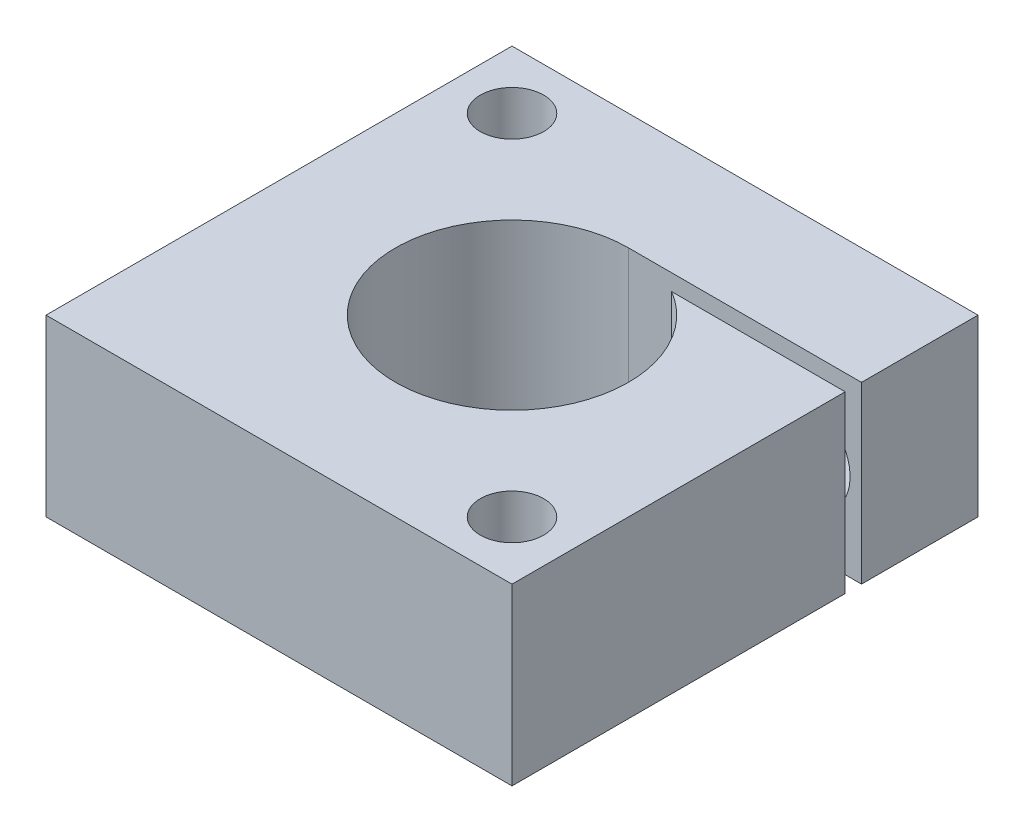
ISO-10303-21;
HEADER;
FILE_DESCRIPTION(('STEP AP214'),'2;1');
FILE_NAME('part.step','',(''),(''),'','','');
FILE_SCHEMA(('AUTOMOTIVE_DESIGN { 1 0 10303 214 1 1 1 1 }'));
ENDSEC;
DATA;
#1=APPLICATION_CONTEXT('core data for automotive mechanical design processes');
#2=APPLICATION_PROTOCOL_DEFINITION('international standard','automotive_design',2000,#1);
#3=PRODUCT_CONTEXT('',#1,'mechanical');
#4=PRODUCT('Part','Part','',(#3));
#5=PRODUCT_RELATED_PRODUCT_CATEGORY('part','',(#4));
#6=PRODUCT_DEFINITION_FORMATION('','',#4);
#7=PRODUCT_DEFINITION_CONTEXT('part definition',#1,'design');
#8=PRODUCT_DEFINITION('design','',#6,#7);
#9=PRODUCT_DEFINITION_SHAPE('','',#8);
#10=(LENGTH_UNIT() NAMED_UNIT(*) SI_UNIT(.MILLI.,.METRE.));
#11=(NAMED_UNIT(*) PLANE_ANGLE_UNIT() SI_UNIT($,.RADIAN.));
#12=(NAMED_UNIT(*) SI_UNIT($,.STERADIAN.) SOLID_ANGLE_UNIT());
#13=UNCERTAINTY_MEASURE_WITH_UNIT(LENGTH_MEASURE(1.E-05),#10,'distance_accuracy_value','');
#14=(GEOMETRIC_REPRESENTATION_CONTEXT(3) GLOBAL_UNCERTAINTY_ASSIGNED_CONTEXT((#13)) GLOBAL_UNIT_ASSIGNED_CONTEXT((#10,
#11,#12)) REPRESENTATION_CONTEXT('',''));
#15=CARTESIAN_POINT('',(0.,0.,0.));
#16=DIRECTION('',(0.,0.,1.));
#17=DIRECTION('',(1.,0.,0.));
#18=AXIS2_PLACEMENT_3D('',#15,#16,#17);
#19=CARTESIAN_POINT('',(-23.8993780326795,9.525,-15.7202520192622));
#20=DIRECTION('',(1.,0.,0.));
#21=DIRECTION('',(0.,0.,-1.));
#22=AXIS2_PLACEMENT_3D('',#19,#20,#21);
#23=PLANE('',#22);
#24=DIRECTION('',(0.,0.,1.));
#25=VECTOR('',#24,1.);
#26=CARTESIAN_POINT('',(-23.8993780326795,0.,-15.7202520192622));
#27=LINE('',#26,#25);
#28=CARTESIAN_POINT('',(-23.8993780326795,0.,-15.7202520192622));
#29=VERTEX_POINT('',#28);
#30=CARTESIAN_POINT('',(-23.8993780326795,0.,9.67974798073775));
#31=VERTEX_POINT('',#30);
#32=EDGE_CURVE('E135',#29,#31,#27,.T.);
#33=ORIENTED_EDGE('',*,*,#32,.T.);
#34=DIRECTION('',(0.,-1.,0.));
#35=VECTOR('',#34,1.);
#36=CARTESIAN_POINT('',(-23.8993780326795,9.525,9.67974798073775));
#37=LINE('',#36,#35);
#38=CARTESIAN_POINT('',(-23.8993780326795,9.525,9.67974798073775));
#39=VERTEX_POINT('',#38);
#40=EDGE_CURVE('E11',#39,#31,#37,.T.);
#41=ORIENTED_EDGE('',*,*,#40,.F.);
#42=DIRECTION('',(0.,0.,1.));
#43=VECTOR('',#42,1.);
#44=CARTESIAN_POINT('',(-23.8993780326795,9.525,-15.7202520192622));
#45=LINE('',#44,#43);
#46=CARTESIAN_POINT('',(-23.8993780326795,9.525,-15.7202520192622));
#47=VERTEX_POINT('',#46);
#48=EDGE_CURVE('E150',#47,#39,#45,.T.);
#49=ORIENTED_EDGE('',*,*,#48,.F.);
#50=DIRECTION('',(0.,-1.,0.));
#51=VECTOR('',#50,1.);
#52=CARTESIAN_POINT('',(-23.8993780326795,9.525,-15.7202520192622));
#53=LINE('',#52,#51);
#54=EDGE_CURVE('E131',#47,#29,#53,.T.);
#55=ORIENTED_EDGE('',*,*,#54,.T.);
#56=EDGE_LOOP('',(#33,#41,#49,#55));
#57=FACE_BOUND('',#56,.T.);
#58=ADVANCED_FACE('F37',(#57),#23,.F.);
#59=CARTESIAN_POINT('',(-23.8993780326795,9.525,9.67974798073775));
#60=DIRECTION('',(0.,0.,-1.));
#61=DIRECTION('',(-1.,0.,0.));
#62=AXIS2_PLACEMENT_3D('',#59,#60,#61);
#63=PLANE('',#62);
#64=DIRECTION('',(1.,0.,0.));
#65=VECTOR('',#64,1.);
#66=CARTESIAN_POINT('',(-23.8993780326795,0.,9.67974798073775));
#67=LINE('',#66,#65);
#68=CARTESIAN_POINT('',(1.50062196732047,0.,9.67974798073775));
#69=VERTEX_POINT('',#68);
#70=EDGE_CURVE('E138',#31,#69,#67,.T.);
#71=ORIENTED_EDGE('',*,*,#70,.T.);
#72=DIRECTION('',(0.,-1.,0.));
#73=VECTOR('',#72,1.);
#74=CARTESIAN_POINT('',(1.50062196732047,9.525,9.67974798073775));
#75=LINE('',#74,#73);
#76=CARTESIAN_POINT('',(1.50062196732047,9.525,9.67974798073775));
#77=VERTEX_POINT('',#76);
#78=EDGE_CURVE('E45',#77,#69,#75,.T.);
#79=ORIENTED_EDGE('',*,*,#78,.F.);
#80=DIRECTION('',(1.,0.,0.));
#81=VECTOR('',#80,1.);
#82=CARTESIAN_POINT('',(-23.8993780326795,9.525,9.67974798073775));
#83=LINE('',#82,#81);
#84=EDGE_CURVE('E97',#39,#77,#83,.T.);
#85=ORIENTED_EDGE('',*,*,#84,.F.);
#86=ORIENTED_EDGE('',*,*,#40,.T.);
#87=EDGE_LOOP('',(#71,#79,#85,#86));
#88=FACE_BOUND('',#87,.T.);
#89=ADVANCED_FACE('F221',(#88),#63,.F.);
#90=CARTESIAN_POINT('',(1.50062196732046,9.525,-8.48125201926225));
#91=DIRECTION('',(-1.,0.,0.));
#92=DIRECTION('',(0.,0.,1.));
#93=AXIS2_PLACEMENT_3D('',#90,#91,#92);
#94=PLANE('',#93);
#95=DIRECTION('',(0.,0.,-1.));
#96=VECTOR('',#95,1.);
#97=CARTESIAN_POINT('',(1.50062196732046,0.,-8.48125201926225));
#98=LINE('',#97,#96);
#99=CARTESIAN_POINT('',(1.50062196732046,0.,-8.48125201926225));
#100=VERTEX_POINT('',#99);
#101=EDGE_CURVE('E141',#69,#100,#98,.T.);
#102=ORIENTED_EDGE('',*,*,#101,.T.);
#103=DIRECTION('',(0.,-1.,0.));
#104=VECTOR('',#103,1.);
#105=CARTESIAN_POINT('',(1.50062196732046,9.525,-8.48125201926225));
#106=LINE('',#105,#104);
#107=CARTESIAN_POINT('',(1.50062196732046,9.525,-8.48125201926225));
#108=VERTEX_POINT('',#107);
#109=EDGE_CURVE('E157',#108,#100,#106,.T.);
#110=ORIENTED_EDGE('',*,*,#109,.F.);
#111=DIRECTION('',(0.,0.,-1.));
#112=VECTOR('',#111,1.);
#113=CARTESIAN_POINT('',(1.50062196732046,9.525,-8.48125201926225));
#114=LINE('',#113,#112);
#115=EDGE_CURVE('E165',#77,#108,#114,.T.);
#116=ORIENTED_EDGE('',*,*,#115,.F.);
#117=ORIENTED_EDGE('',*,*,#78,.T.);
#118=EDGE_LOOP('',(#102,#110,#116,#117));
#119=FACE_BOUND('',#118,.T.);
#120=ADVANCED_FACE('F163',(#119),#94,.F.);
#121=CARTESIAN_POINT('',(-7.95901092384757,9.525,-8.48125201926225));
#122=DIRECTION('',(0.,0.,1.));
#123=DIRECTION('',(1.,0.,0.));
#124=AXIS2_PLACEMENT_3D('',#121,#122,#123);
#125=PLANE('',#124);
#126=CARTESIAN_POINT('',(-1.67437803267953,4.7625,-8.48125201926225));
#127=DIRECTION('',(0.,0.,-1.));
#128=DIRECTION('',(-1.,0.,0.));
#129=AXIS2_PLACEMENT_3D('',#126,#127,#128);
#130=CIRCLE('',#129,1.89865);
#131=CARTESIAN_POINT('',(-3.57302803267953,4.7625,-8.48125201926225));
#132=VERTEX_POINT('',#131);
#133=EDGE_CURVE('E197',#132,#132,#130,.T.);
#134=ORIENTED_EDGE('',*,*,#133,.F.);
#135=EDGE_LOOP('',(#134));
#136=FACE_BOUND('',#135,.T.);
#137=DIRECTION('',(-1.,0.,0.));
#138=VECTOR('',#137,1.);
#139=CARTESIAN_POINT('',(-7.95901092384757,0.,-8.48125201926225));
#140=LINE('',#139,#138);
#141=CARTESIAN_POINT('',(-7.95901092384757,0.,-8.48125201926225));
#142=VERTEX_POINT('',#141);
#143=EDGE_CURVE('E143',#100,#142,#140,.T.);
#144=ORIENTED_EDGE('',*,*,#143,.T.);
#145=DIRECTION('',(0.,-1.,0.));
#146=VECTOR('',#145,1.);
#147=CARTESIAN_POINT('',(-7.95901092384757,9.525,-8.48125201926225));
#148=LINE('',#147,#146);
#149=CARTESIAN_POINT('',(-7.95901092384757,9.525,-8.48125201926225));
#150=VERTEX_POINT('',#149);
#151=EDGE_CURVE('E154',#150,#142,#148,.T.);
#152=ORIENTED_EDGE('',*,*,#151,.F.);
#153=DIRECTION('',(-1.,0.,0.));
#154=VECTOR('',#153,1.);
#155=CARTESIAN_POINT('',(-7.95901092384757,9.525,-8.48125201926225));
#156=LINE('',#155,#154);
#157=EDGE_CURVE('E177',#108,#150,#156,.T.);
#158=ORIENTED_EDGE('',*,*,#157,.F.);
#159=ORIENTED_EDGE('',*,*,#109,.T.);
#160=EDGE_LOOP('',(#144,#152,#158,#159));
#161=FACE_BOUND('',#160,.T.);
#162=ADVANCED_FACE('F173',(#136,#161),#125,.F.);
#163=CARTESIAN_POINT('',(-11.1993780326795,9.525,-3.02025201926225));
#164=DIRECTION('',(0.,-1.,0.));
#165=DIRECTION('',(0.,0.,-1.));
#166=AXIS2_PLACEMENT_3D('',#163,#164,#165);
#167=CYLINDRICAL_SURFACE('',#166,6.35);
#168=CARTESIAN_POINT('',(-11.1993780326795,0.,-3.02025201926225));
#169=DIRECTION('',(0.,-1.,0.));
#170=DIRECTION('',(0.,0.,1.));
#171=AXIS2_PLACEMENT_3D('',#168,#169,#170);
#172=CIRCLE('',#171,6.35);
#173=CARTESIAN_POINT('',(-11.1993780326795,0.,-9.37025201926225));
#174=VERTEX_POINT('',#173);
#175=EDGE_CURVE('E145',#142,#174,#172,.T.);
#176=ORIENTED_EDGE('',*,*,#175,.T.);
#177=DIRECTION('',(0.,-1.,0.));
#178=VECTOR('',#177,1.);
#179=CARTESIAN_POINT('',(-11.1993780326795,9.525,-9.37025201926225));
#180=LINE('',#179,#178);
#181=CARTESIAN_POINT('',(-11.1993780326795,9.525,-9.37025201926225));
#182=VERTEX_POINT('',#181);
#183=EDGE_CURVE('E126',#182,#174,#180,.T.);
#184=ORIENTED_EDGE('',*,*,#183,.F.);
#185=CARTESIAN_POINT('',(-11.1993780326795,9.525,-3.02025201926225));
#186=DIRECTION('',(0.,-1.,0.));
#187=DIRECTION('',(0.,0.,1.));
#188=AXIS2_PLACEMENT_3D('',#185,#186,#187);
#189=CIRCLE('',#188,6.35);
#190=EDGE_CURVE('E117',#150,#182,#189,.T.);
#191=ORIENTED_EDGE('',*,*,#190,.F.);
#192=ORIENTED_EDGE('',*,*,#151,.T.);
#193=EDGE_LOOP('',(#176,#184,#191,#192));
#194=FACE_BOUND('',#193,.T.);
#195=ADVANCED_FACE('F176',(#194),#167,.F.);
#196=CARTESIAN_POINT('',(-11.1993780326795,9.525,-9.37025201926225));
#197=DIRECTION('',(0.,0.,-1.));
#198=DIRECTION('',(-1.,0.,0.));
#199=AXIS2_PLACEMENT_3D('',#196,#197,#198);
#200=PLANE('',#199);
#201=CARTESIAN_POINT('',(-1.67437803267954,4.7625,-9.37025201926225));
#202=DIRECTION('',(0.,0.,-1.));
#203=DIRECTION('',(-1.,0.,0.));
#204=AXIS2_PLACEMENT_3D('',#201,#202,#203);
#205=CIRCLE('',#204,2.55269999999999);
#206=CARTESIAN_POINT('',(-4.22707803267953,4.7625,-9.37025201926225));
#207=VERTEX_POINT('',#206);
#208=EDGE_CURVE('E200',#207,#207,#205,.T.);
#209=ORIENTED_EDGE('',*,*,#208,.T.);
#210=EDGE_LOOP('',(#209));
#211=FACE_BOUND('',#210,.T.);
#212=DIRECTION('',(1.,0.,0.));
#213=VECTOR('',#212,1.);
#214=CARTESIAN_POINT('',(-11.1993780326795,0.,-9.37025201926225));
#215=LINE('',#214,#213);
#216=CARTESIAN_POINT('',(1.50062196732046,0.,-9.37025201926225));
#217=VERTEX_POINT('',#216);
#218=EDGE_CURVE('E125',#174,#217,#215,.T.);
#219=ORIENTED_EDGE('',*,*,#218,.T.);
#220=DIRECTION('',(0.,-1.,0.));
#221=VECTOR('',#220,1.);
#222=CARTESIAN_POINT('',(1.50062196732046,9.525,-9.37025201926225));
#223=LINE('',#222,#221);
#224=CARTESIAN_POINT('',(1.50062196732046,9.525,-9.37025201926225));
#225=VERTEX_POINT('',#224);
#226=EDGE_CURVE('E122',#225,#217,#223,.T.);
#227=ORIENTED_EDGE('',*,*,#226,.F.);
#228=DIRECTION('',(1.,0.,0.));
#229=VECTOR('',#228,1.);
#230=CARTESIAN_POINT('',(-11.1993780326795,9.525,-9.37025201926225));
#231=LINE('',#230,#229);
#232=EDGE_CURVE('E111',#182,#225,#231,.T.);
#233=ORIENTED_EDGE('',*,*,#232,.F.);
#234=ORIENTED_EDGE('',*,*,#183,.T.);
#235=EDGE_LOOP('',(#219,#227,#233,#234));
#236=FACE_BOUND('',#235,.T.);
#237=ADVANCED_FACE('F123',(#211,#236),#200,.F.);
#238=CARTESIAN_POINT('',(1.50062196732046,9.525,-15.7202520192622));
#239=DIRECTION('',(-1.,0.,0.));
#240=DIRECTION('',(0.,0.,1.));
#241=AXIS2_PLACEMENT_3D('',#238,#239,#240);
#242=PLANE('',#241);
#243=DIRECTION('',(0.,0.,-1.));
#244=VECTOR('',#243,1.);
#245=CARTESIAN_POINT('',(1.50062196732046,0.,-15.7202520192622));
#246=LINE('',#245,#244);
#247=CARTESIAN_POINT('',(1.50062196732046,0.,-15.7202520192622));
#248=VERTEX_POINT('',#247);
#249=EDGE_CURVE('E83',#217,#248,#246,.T.);
#250=ORIENTED_EDGE('',*,*,#249,.T.);
#251=DIRECTION('',(0.,-1.,0.));
#252=VECTOR('',#251,1.);
#253=CARTESIAN_POINT('',(1.50062196732046,9.525,-15.7202520192622));
#254=LINE('',#253,#252);
#255=CARTESIAN_POINT('',(1.50062196732046,9.525,-15.7202520192622));
#256=VERTEX_POINT('',#255);
#257=EDGE_CURVE('E127',#256,#248,#254,.T.);
#258=ORIENTED_EDGE('',*,*,#257,.F.);
#259=DIRECTION('',(0.,0.,-1.));
#260=VECTOR('',#259,1.);
#261=CARTESIAN_POINT('',(1.50062196732046,9.525,-15.7202520192622));
#262=LINE('',#261,#260);
#263=EDGE_CURVE('E115',#225,#256,#262,.T.);
#264=ORIENTED_EDGE('',*,*,#263,.F.);
#265=ORIENTED_EDGE('',*,*,#226,.T.);
#266=EDGE_LOOP('',(#250,#258,#264,#265));
#267=FACE_BOUND('',#266,.T.);
#268=ADVANCED_FACE('F129',(#267),#242,.F.);
#269=CARTESIAN_POINT('',(-23.8993780326795,9.525,-15.7202520192622));
#270=DIRECTION('',(0.,0.,1.));
#271=DIRECTION('',(1.,0.,0.));
#272=AXIS2_PLACEMENT_3D('',#269,#270,#271);
#273=PLANE('',#272);
#274=CARTESIAN_POINT('',(-1.67437803267954,4.7625,-15.7202520192622));
#275=DIRECTION('',(0.,0.,-1.));
#276=DIRECTION('',(-1.,0.,0.));
#277=AXIS2_PLACEMENT_3D('',#274,#275,#276);
#278=CIRCLE('',#277,2.55269999999999);
#279=CARTESIAN_POINT('',(-4.22707803267952,4.7625,-15.7202520192622));
#280=VERTEX_POINT('',#279);
#281=EDGE_CURVE('E203',#280,#280,#278,.T.);
#282=ORIENTED_EDGE('',*,*,#281,.F.);
#283=EDGE_LOOP('',(#282));
#284=FACE_BOUND('',#283,.T.);
#285=DIRECTION('',(-1.,0.,0.));
#286=VECTOR('',#285,1.);
#287=CARTESIAN_POINT('',(-23.8993780326795,0.,-15.7202520192622));
#288=LINE('',#287,#286);
#289=EDGE_CURVE('E89',#248,#29,#288,.T.);
#290=ORIENTED_EDGE('',*,*,#289,.T.);
#291=ORIENTED_EDGE('',*,*,#54,.F.);
#292=DIRECTION('',(-1.,0.,0.));
#293=VECTOR('',#292,1.);
#294=CARTESIAN_POINT('',(-23.8993780326795,9.525,-15.7202520192622));
#295=LINE('',#294,#293);
#296=EDGE_CURVE('E53',#256,#47,#295,.T.);
#297=ORIENTED_EDGE('',*,*,#296,.F.);
#298=ORIENTED_EDGE('',*,*,#257,.T.);
#299=EDGE_LOOP('',(#290,#291,#297,#298));
#300=FACE_BOUND('',#299,.T.);
#301=ADVANCED_FACE('F209',(#284,#300),#273,.F.);
#302=CARTESIAN_POINT('',(-11.1993780326795,9.525,-3.02025201926225));
#303=DIRECTION('',(0.,1.,0.));
#304=DIRECTION('',(0.,0.,1.));
#305=AXIS2_PLACEMENT_3D('',#302,#303,#304);
#306=PLANE('',#305);
#307=CARTESIAN_POINT('',(-20.7243780326795,9.525,-12.5452520192622));
#308=DIRECTION('',(0.,1.,0.));
#309=DIRECTION('',(0.,0.,1.));
#310=AXIS2_PLACEMENT_3D('',#307,#308,#309);
#311=CIRCLE('',#310,1.72719999999999);
#312=CARTESIAN_POINT('',(-20.7243780326795,9.525,-10.8180520192623));
#313=VERTEX_POINT('',#312);
#314=EDGE_CURVE('E191',#313,#313,#311,.T.);
#315=ORIENTED_EDGE('',*,*,#314,.F.);
#316=EDGE_LOOP('',(#315));
#317=FACE_BOUND('',#316,.T.);
#318=CARTESIAN_POINT('',(-1.67437803267953,9.525,6.50474798073775));
#319=DIRECTION('',(0.,1.,0.));
#320=DIRECTION('',(0.,0.,1.));
#321=AXIS2_PLACEMENT_3D('',#318,#319,#320);
#322=CIRCLE('',#321,1.72719999999999);
#323=CARTESIAN_POINT('',(-1.67437803267953,9.525,8.23194798073774));
#324=VERTEX_POINT('',#323);
#325=EDGE_CURVE('E185',#324,#324,#322,.T.);
#326=ORIENTED_EDGE('',*,*,#325,.F.);
#327=EDGE_LOOP('',(#326));
#328=FACE_BOUND('',#327,.T.);
#329=ORIENTED_EDGE('',*,*,#48,.T.);
#330=ORIENTED_EDGE('',*,*,#84,.T.);
#331=ORIENTED_EDGE('',*,*,#115,.T.);
#332=ORIENTED_EDGE('',*,*,#157,.T.);
#333=ORIENTED_EDGE('',*,*,#190,.T.);
#334=ORIENTED_EDGE('',*,*,#232,.T.);
#335=ORIENTED_EDGE('',*,*,#263,.T.);
#336=ORIENTED_EDGE('',*,*,#296,.T.);
#337=EDGE_LOOP('',(#329,#330,#331,#332,#333,#334,#335,#336));
#338=FACE_BOUND('',#337,.T.);
#339=ADVANCED_FACE('F113',(#317,#328,#338),#306,.T.);
#340=CARTESIAN_POINT('',(-11.1993780326795,0.,-3.02025201926225));
#341=DIRECTION('',(0.,1.,0.));
#342=DIRECTION('',(0.,0.,1.));
#343=AXIS2_PLACEMENT_3D('',#340,#341,#342);
#344=PLANE('',#343);
#345=CARTESIAN_POINT('',(-20.7243780326795,0.,-12.5452520192622));
#346=DIRECTION('',(0.,1.,0.));
#347=DIRECTION('',(0.,0.,1.));
#348=AXIS2_PLACEMENT_3D('',#345,#346,#347);
#349=CIRCLE('',#348,1.7272);
#350=CARTESIAN_POINT('',(-20.7243780326795,0.,-10.8180520192623));
#351=VERTEX_POINT('',#350);
#352=EDGE_CURVE('E188',#351,#351,#349,.T.);
#353=ORIENTED_EDGE('',*,*,#352,.T.);
#354=EDGE_LOOP('',(#353));
#355=FACE_BOUND('',#354,.T.);
#356=CARTESIAN_POINT('',(-1.67437803267953,0.,6.50474798073775));
#357=DIRECTION('',(0.,1.,0.));
#358=DIRECTION('',(0.,0.,1.));
#359=AXIS2_PLACEMENT_3D('',#356,#357,#358);
#360=CIRCLE('',#359,1.7272);
#361=CARTESIAN_POINT('',(-1.67437803267953,0.,8.23194798073775));
#362=VERTEX_POINT('',#361);
#363=EDGE_CURVE('E139',#362,#362,#360,.T.);
#364=ORIENTED_EDGE('',*,*,#363,.T.);
#365=EDGE_LOOP('',(#364));
#366=FACE_BOUND('',#365,.T.);
#367=ORIENTED_EDGE('',*,*,#32,.F.);
#368=ORIENTED_EDGE('',*,*,#289,.F.);
#369=ORIENTED_EDGE('',*,*,#249,.F.);
#370=ORIENTED_EDGE('',*,*,#218,.F.);
#371=ORIENTED_EDGE('',*,*,#175,.F.);
#372=ORIENTED_EDGE('',*,*,#143,.F.);
#373=ORIENTED_EDGE('',*,*,#101,.F.);
#374=ORIENTED_EDGE('',*,*,#70,.F.);
#375=EDGE_LOOP('',(#367,#368,#369,#370,#371,#372,#373,#374));
#376=FACE_BOUND('',#375,.T.);
#377=ADVANCED_FACE('F169',(#355,#366,#376),#344,.F.);
#378=CARTESIAN_POINT('',(-1.67437803267953,9.525,6.50474798073775));
#379=DIRECTION('',(0.,1.,0.));
#380=DIRECTION('',(0.,0.,1.));
#381=AXIS2_PLACEMENT_3D('',#378,#379,#380);
#382=CYLINDRICAL_SURFACE('',#381,1.72719999999999);
#383=ORIENTED_EDGE('',*,*,#363,.F.);
#384=EDGE_LOOP('',(#383));
#385=FACE_BOUND('',#384,.T.);
#386=ORIENTED_EDGE('',*,*,#325,.T.);
#387=EDGE_LOOP('',(#386));
#388=FACE_BOUND('',#387,.T.);
#389=ADVANCED_FACE('F260',(#385,#388),#382,.F.);
#390=CARTESIAN_POINT('',(-20.7243780326795,9.525,-12.5452520192622));
#391=DIRECTION('',(0.,1.,0.));
#392=DIRECTION('',(0.,0.,1.));
#393=AXIS2_PLACEMENT_3D('',#390,#391,#392);
#394=CYLINDRICAL_SURFACE('',#393,1.72719999999999);
#395=ORIENTED_EDGE('',*,*,#352,.F.);
#396=EDGE_LOOP('',(#395));
#397=FACE_BOUND('',#396,.T.);
#398=ORIENTED_EDGE('',*,*,#314,.T.);
#399=EDGE_LOOP('',(#398));
#400=FACE_BOUND('',#399,.T.);
#401=ADVANCED_FACE('F256',(#397,#400),#394,.F.);
#402=CARTESIAN_POINT('',(-1.67437803267953,4.7625,2.69474798073775));
#403=DIRECTION('',(0.,0.,-1.));
#404=DIRECTION('',(-1.,0.,0.));
#405=AXIS2_PLACEMENT_3D('',#402,#403,#404);
#406=CONICAL_SURFACE('',#405,1.89865,1.02974425867665);
#407=CARTESIAN_POINT('',(-1.67437803267954,4.7625,3.83557199505443));
#408=VERTEX_POINT('',#407);
#409=VERTEX_LOOP('',#408);
#410=FACE_BOUND('',#409,.T.);
#411=CARTESIAN_POINT('',(-1.67437803267953,4.7625,2.69474798073775));
#412=DIRECTION('',(0.,0.,-1.));
#413=DIRECTION('',(-1.,0.,0.));
#414=AXIS2_PLACEMENT_3D('',#411,#412,#413);
#415=CIRCLE('',#414,1.89865);
#416=CARTESIAN_POINT('',(-3.57302803267953,4.7625,2.69474798073775));
#417=VERTEX_POINT('',#416);
#418=EDGE_CURVE('E194',#417,#417,#415,.T.);
#419=ORIENTED_EDGE('',*,*,#418,.T.);
#420=EDGE_LOOP('',(#419));
#421=FACE_BOUND('',#420,.T.);
#422=ADVANCED_FACE('F250',(#410,#421),#406,.F.);
#423=CARTESIAN_POINT('',(-1.67437803267953,4.7625,-8.48125201926225));
#424=DIRECTION('',(0.,0.,-1.));
#425=DIRECTION('',(-1.,0.,0.));
#426=AXIS2_PLACEMENT_3D('',#423,#424,#425);
#427=CYLINDRICAL_SURFACE('',#426,1.89865);
#428=ORIENTED_EDGE('',*,*,#418,.F.);
#429=EDGE_LOOP('',(#428));
#430=FACE_BOUND('',#429,.T.);
#431=ORIENTED_EDGE('',*,*,#133,.T.);
#432=EDGE_LOOP('',(#431));
#433=FACE_BOUND('',#432,.T.);
#434=ADVANCED_FACE('F245',(#430,#433),#427,.F.);
#435=CARTESIAN_POINT('',(-1.67437803267954,4.7625,-15.7202520192622));
#436=DIRECTION('',(0.,0.,-1.));
#437=DIRECTION('',(-1.,0.,0.));
#438=AXIS2_PLACEMENT_3D('',#435,#436,#437);
#439=CYLINDRICAL_SURFACE('',#438,2.55269999999999);
#440=ORIENTED_EDGE('',*,*,#208,.F.);
#441=EDGE_LOOP('',(#440));
#442=FACE_BOUND('',#441,.T.);
#443=ORIENTED_EDGE('',*,*,#281,.T.);
#444=EDGE_LOOP('',(#443));
#445=FACE_BOUND('',#444,.T.);
#446=ADVANCED_FACE('F207',(#442,#445),#439,.F.);
#447=CLOSED_SHELL('',(#58,#89,#120,#162,#195,#237,#268,#301,#339,#377,#389,#401,#422,#434,#446));
#448=MANIFOLD_SOLID_BREP('B2',#447);
#449=ADVANCED_BREP_SHAPE_REPRESENTATION('',(#18,#448),#14);
#450=SHAPE_DEFINITION_REPRESENTATION(#9,#449);
ENDSEC;
END-ISO-10303-21;
